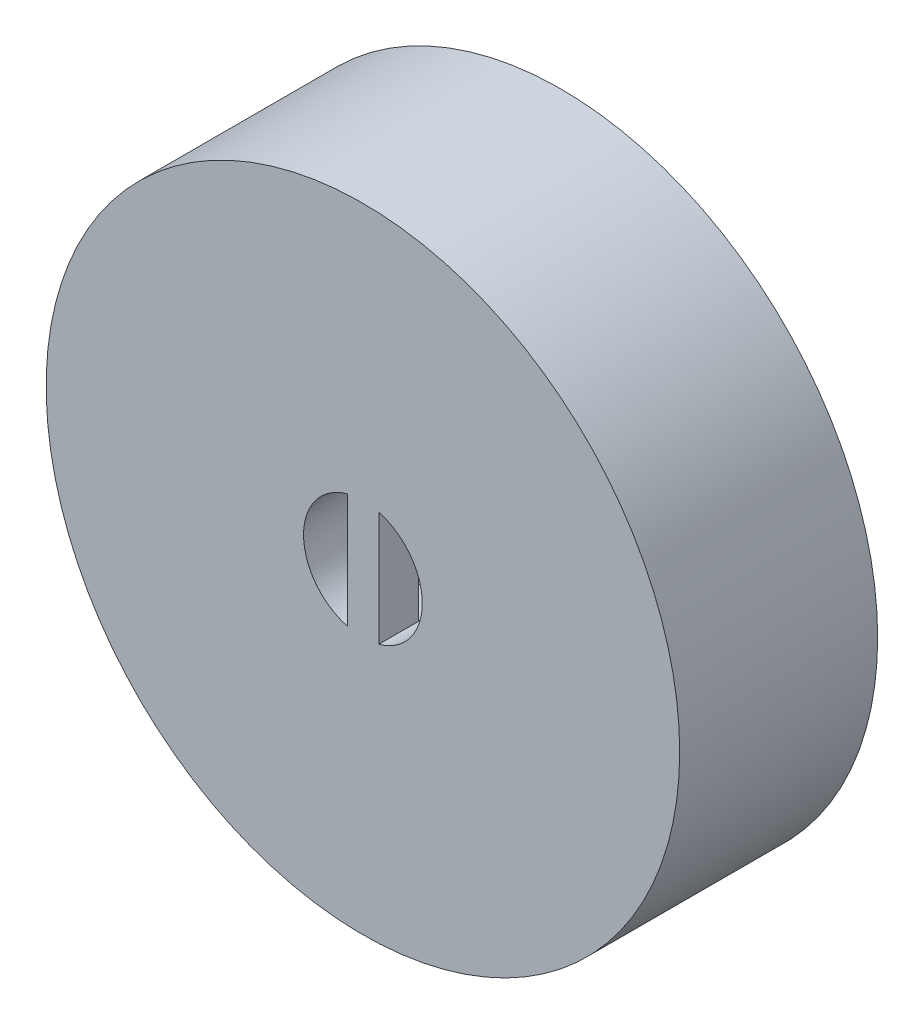
ISO-10303-21;
HEADER;
FILE_DESCRIPTION(('STEP AP214'),'2;1');
FILE_NAME('part.step','',(''),(''),'','','');
FILE_SCHEMA(('AUTOMOTIVE_DESIGN { 1 0 10303 214 1 1 1 1 }'));
ENDSEC;
DATA;
#1=APPLICATION_CONTEXT('core data for automotive mechanical design processes');
#2=APPLICATION_PROTOCOL_DEFINITION('international standard','automotive_design',2000,#1);
#3=PRODUCT_CONTEXT('',#1,'mechanical');
#4=PRODUCT('Part','Part','',(#3));
#5=PRODUCT_RELATED_PRODUCT_CATEGORY('part','',(#4));
#6=PRODUCT_DEFINITION_FORMATION('','',#4);
#7=PRODUCT_DEFINITION_CONTEXT('part definition',#1,'design');
#8=PRODUCT_DEFINITION('design','',#6,#7);
#9=PRODUCT_DEFINITION_SHAPE('','',#8);
#10=(LENGTH_UNIT() NAMED_UNIT(*) SI_UNIT(.MILLI.,.METRE.));
#11=(NAMED_UNIT(*) PLANE_ANGLE_UNIT() SI_UNIT($,.RADIAN.));
#12=(NAMED_UNIT(*) SI_UNIT($,.STERADIAN.) SOLID_ANGLE_UNIT());
#13=UNCERTAINTY_MEASURE_WITH_UNIT(LENGTH_MEASURE(1.E-05),#10,'distance_accuracy_value','');
#14=(GEOMETRIC_REPRESENTATION_CONTEXT(3) GLOBAL_UNCERTAINTY_ASSIGNED_CONTEXT((#13)) GLOBAL_UNIT_ASSIGNED_CONTEXT((#10,
#11,#12)) REPRESENTATION_CONTEXT('',''));
#15=CARTESIAN_POINT('',(0.,0.,0.));
#16=DIRECTION('',(0.,0.,1.));
#17=DIRECTION('',(1.,0.,0.));
#18=AXIS2_PLACEMENT_3D('',#15,#16,#17);
#19=CARTESIAN_POINT('',(-6.57556589733585,0.,-9.525));
#20=DIRECTION('',(0.,0.,-1.));
#21=DIRECTION('',(-1.,0.,0.));
#22=AXIS2_PLACEMENT_3D('',#19,#20,#21);
#23=PLANE('',#22);
#24=CARTESIAN_POINT('',(-6.57556589733585,0.,-9.525));
#25=DIRECTION('',(0.,0.,-1.));
#26=DIRECTION('',(-1.,0.,0.));
#27=AXIS2_PLACEMENT_3D('',#24,#25,#26);
#28=CIRCLE('',#27,9.525);
#29=CARTESIAN_POINT('',(2.94943410266415,0.,-9.525));
#30=VERTEX_POINT('',#29);
#31=EDGE_CURVE('E130',#30,#30,#28,.T.);
#32=ORIENTED_EDGE('',*,*,#31,.T.);
#33=EDGE_LOOP('',(#32));
#34=FACE_BOUND('',#33,.T.);
#35=CARTESIAN_POINT('',(-6.57556589733585,0.,-9.525));
#36=DIRECTION('',(0.,0.,1.));
#37=DIRECTION('',(1.,0.,0.));
#38=AXIS2_PLACEMENT_3D('',#35,#36,#37);
#39=CIRCLE('',#38,4.7625);
#40=CARTESIAN_POINT('',(-5.30556589733585,-4.5900442535993,-9.525));
#41=VERTEX_POINT('',#40);
#42=CARTESIAN_POINT('',(-5.30556589733585,4.5900442535993,-9.525));
#43=VERTEX_POINT('',#42);
#44=EDGE_CURVE('E121',#41,#43,#39,.T.);
#45=ORIENTED_EDGE('',*,*,#44,.T.);
#46=DIRECTION('',(-0.999997305514352,0.00232141423185958,0.));
#47=VECTOR('',#46,1.);
#48=CARTESIAN_POINT('',(-5.30556589733585,4.5900442535993,-9.525));
#49=LINE('',#48,#47);
#50=CARTESIAN_POINT('',(-7.82424147867847,4.59589115869367,-9.525));
#51=VERTEX_POINT('',#50);
#52=EDGE_CURVE('E106',#43,#51,#49,.T.);
#53=ORIENTED_EDGE('',*,*,#52,.T.);
#54=CARTESIAN_POINT('',(-6.57556589733585,0.,-9.525));
#55=DIRECTION('',(0.,0.,1.));
#56=DIRECTION('',(1.,0.,0.));
#57=AXIS2_PLACEMENT_3D('',#54,#55,#56);
#58=CIRCLE('',#57,4.7625);
#59=CARTESIAN_POINT('',(-7.82424147867847,-4.59589115869367,-9.525));
#60=VERTEX_POINT('',#59);
#61=EDGE_CURVE('E129',#51,#60,#58,.T.);
#62=ORIENTED_EDGE('',*,*,#61,.T.);
#63=DIRECTION('',(-0.999997305514352,-0.00232141423185924,0.));
#64=VECTOR('',#63,1.);
#65=CARTESIAN_POINT('',(-5.30556589733585,-4.5900442535993,-9.525));
#66=LINE('',#65,#64);
#67=EDGE_CURVE('E157',#41,#60,#66,.T.);
#68=ORIENTED_EDGE('',*,*,#67,.F.);
#69=EDGE_LOOP('',(#45,#53,#62,#68));
#70=FACE_BOUND('',#69,.T.);
#71=ADVANCED_FACE('F34',(#34,#70),#23,.T.);
#72=CARTESIAN_POINT('',(-5.30556589733585,4.5900442535993,-9.525));
#73=DIRECTION('',(-1.,0.,0.));
#74=DIRECTION('',(0.,0.,1.));
#75=AXIS2_PLACEMENT_3D('',#72,#73,#74);
#76=PLANE('',#75);
#77=DIRECTION('',(0.,-1.,0.));
#78=VECTOR('',#77,1.);
#79=CARTESIAN_POINT('',(-5.30556589733585,4.5900442535993,12.7));
#80=LINE('',#79,#78);
#81=CARTESIAN_POINT('',(-5.30556589733585,4.5900442535993,12.7));
#82=VERTEX_POINT('',#81);
#83=CARTESIAN_POINT('',(-5.30556589733585,-4.5900442535993,12.7));
#84=VERTEX_POINT('',#83);
#85=EDGE_CURVE('E97',#82,#84,#80,.T.);
#86=ORIENTED_EDGE('',*,*,#85,.F.);
#87=DIRECTION('',(0.,0.,1.));
#88=VECTOR('',#87,1.);
#89=CARTESIAN_POINT('',(-5.30556589733585,4.5900442535993,-9.525));
#90=LINE('',#89,#88);
#91=CARTESIAN_POINT('',(-5.30556589733585,4.5900442535993,15.875));
#92=VERTEX_POINT('',#91);
#93=EDGE_CURVE('E122',#82,#92,#90,.T.);
#94=ORIENTED_EDGE('',*,*,#93,.T.);
#95=DIRECTION('',(0.,1.,0.));
#96=VECTOR('',#95,1.);
#97=CARTESIAN_POINT('',(-5.30556589733585,4.5900442535993,15.875));
#98=LINE('',#97,#96);
#99=CARTESIAN_POINT('',(-5.30556589733585,-4.5900442535993,15.875));
#100=VERTEX_POINT('',#99);
#101=EDGE_CURVE('E112',#92,#100,#98,.F.);
#102=ORIENTED_EDGE('',*,*,#101,.T.);
#103=DIRECTION('',(0.,0.,1.));
#104=VECTOR('',#103,1.);
#105=CARTESIAN_POINT('',(-5.30556589733585,-4.5900442535993,-9.525));
#106=LINE('',#105,#104);
#107=EDGE_CURVE('E109',#84,#100,#106,.T.);
#108=ORIENTED_EDGE('',*,*,#107,.F.);
#109=EDGE_LOOP('',(#86,#94,#102,#108));
#110=FACE_BOUND('',#109,.T.);
#111=ADVANCED_FACE('F110',(#110),#76,.F.);
#112=CARTESIAN_POINT('',(-7.82424147867847,4.59589115869367,-9.525));
#113=DIRECTION('',(-1.,0.,0.));
#114=DIRECTION('',(0.,0.,1.));
#115=AXIS2_PLACEMENT_3D('',#112,#113,#114);
#116=PLANE('',#115);
#117=DIRECTION('',(0.,0.,1.));
#118=VECTOR('',#117,1.);
#119=CARTESIAN_POINT('',(-7.82424147867847,4.59589115869367,-9.525));
#120=LINE('',#119,#118);
#121=CARTESIAN_POINT('',(-7.82424147867847,4.59589115869367,12.7));
#122=VERTEX_POINT('',#121);
#123=CARTESIAN_POINT('',(-7.82424147867847,4.59589115869367,15.875));
#124=VERTEX_POINT('',#123);
#125=EDGE_CURVE('E52',#122,#124,#120,.T.);
#126=ORIENTED_EDGE('',*,*,#125,.F.);
#127=DIRECTION('',(0.,-1.,0.));
#128=VECTOR('',#127,1.);
#129=CARTESIAN_POINT('',(-7.82424147867847,4.59589115869367,12.7));
#130=LINE('',#129,#128);
#131=CARTESIAN_POINT('',(-7.82424147867847,-4.59589115869367,12.7));
#132=VERTEX_POINT('',#131);
#133=EDGE_CURVE('E96',#122,#132,#130,.T.);
#134=ORIENTED_EDGE('',*,*,#133,.T.);
#135=DIRECTION('',(0.,0.,1.));
#136=VECTOR('',#135,1.);
#137=CARTESIAN_POINT('',(-7.82424147867847,-4.59589115869367,-9.525));
#138=LINE('',#137,#136);
#139=CARTESIAN_POINT('',(-7.82424147867847,-4.59589115869367,15.875));
#140=VERTEX_POINT('',#139);
#141=EDGE_CURVE('E149',#132,#140,#138,.T.);
#142=ORIENTED_EDGE('',*,*,#141,.T.);
#143=DIRECTION('',(0.,1.,0.));
#144=VECTOR('',#143,1.);
#145=CARTESIAN_POINT('',(-7.82424147867847,0.,15.875));
#146=LINE('',#145,#144);
#147=EDGE_CURVE('E38',#124,#140,#146,.F.);
#148=ORIENTED_EDGE('',*,*,#147,.F.);
#149=EDGE_LOOP('',(#126,#134,#142,#148));
#150=FACE_BOUND('',#149,.T.);
#151=ADVANCED_FACE('F148',(#150),#116,.T.);
#152=CARTESIAN_POINT('',(-6.57556589733585,0.,15.875));
#153=DIRECTION('',(0.,0.,1.));
#154=DIRECTION('',(1.,0.,0.));
#155=AXIS2_PLACEMENT_3D('',#152,#153,#154);
#156=PLANE('',#155);
#157=CARTESIAN_POINT('',(-6.57556589733585,0.,15.875));
#158=DIRECTION('',(0.,0.,1.));
#159=DIRECTION('',(1.,0.,0.));
#160=AXIS2_PLACEMENT_3D('',#157,#158,#159);
#161=CIRCLE('',#160,4.7625);
#162=EDGE_CURVE('E139',#100,#92,#161,.T.);
#163=ORIENTED_EDGE('',*,*,#162,.F.);
#164=ORIENTED_EDGE('',*,*,#101,.F.);
#165=EDGE_LOOP('',(#163,#164));
#166=FACE_BOUND('',#165,.T.);
#167=CARTESIAN_POINT('',(-6.57556589733585,0.,15.875));
#168=DIRECTION('',(0.,0.,1.));
#169=DIRECTION('',(1.,0.,0.));
#170=AXIS2_PLACEMENT_3D('',#167,#168,#169);
#171=CIRCLE('',#170,25.4);
#172=CARTESIAN_POINT('',(18.8244341026641,0.,15.875));
#173=VERTEX_POINT('',#172);
#174=EDGE_CURVE('E44',#173,#173,#171,.T.);
#175=ORIENTED_EDGE('',*,*,#174,.T.);
#176=EDGE_LOOP('',(#175));
#177=FACE_BOUND('',#176,.T.);
#178=CARTESIAN_POINT('',(-6.57556589733585,0.,15.875));
#179=DIRECTION('',(0.,0.,1.));
#180=DIRECTION('',(1.,0.,0.));
#181=AXIS2_PLACEMENT_3D('',#178,#179,#180);
#182=CIRCLE('',#181,4.7625);
#183=EDGE_CURVE('E140',#124,#140,#182,.T.);
#184=ORIENTED_EDGE('',*,*,#183,.F.);
#185=ORIENTED_EDGE('',*,*,#147,.T.);
#186=EDGE_LOOP('',(#184,#185));
#187=FACE_BOUND('',#186,.T.);
#188=ADVANCED_FACE('F145',(#166,#177,#187),#156,.T.);
#189=CARTESIAN_POINT('',(-6.57556589733585,0.,15.875));
#190=DIRECTION('',(0.,0.,-1.));
#191=DIRECTION('',(-1.,0.,0.));
#192=AXIS2_PLACEMENT_3D('',#189,#190,#191);
#193=CYLINDRICAL_SURFACE('',#192,25.4);
#194=ORIENTED_EDGE('',*,*,#174,.F.);
#195=EDGE_LOOP('',(#194));
#196=FACE_BOUND('',#195,.T.);
#197=CARTESIAN_POINT('',(-6.57556589733585,0.,0.));
#198=DIRECTION('',(0.,0.,1.));
#199=DIRECTION('',(1.,0.,0.));
#200=AXIS2_PLACEMENT_3D('',#197,#198,#199);
#201=CIRCLE('',#200,25.4);
#202=CARTESIAN_POINT('',(18.8244341026641,0.,0.));
#203=VERTEX_POINT('',#202);
#204=EDGE_CURVE('E132',#203,#203,#201,.T.);
#205=ORIENTED_EDGE('',*,*,#204,.T.);
#206=EDGE_LOOP('',(#205));
#207=FACE_BOUND('',#206,.T.);
#208=ADVANCED_FACE('F36',(#196,#207),#193,.T.);
#209=CARTESIAN_POINT('',(-6.57556589733585,0.,0.));
#210=DIRECTION('',(0.,0.,1.));
#211=DIRECTION('',(1.,0.,0.));
#212=AXIS2_PLACEMENT_3D('',#209,#210,#211);
#213=PLANE('',#212);
#214=CARTESIAN_POINT('',(-6.57556589733585,0.,0.));
#215=DIRECTION('',(0.,0.,-1.));
#216=DIRECTION('',(-1.,0.,0.));
#217=AXIS2_PLACEMENT_3D('',#214,#215,#216);
#218=CIRCLE('',#217,9.525);
#219=CARTESIAN_POINT('',(2.94943410266415,0.,0.));
#220=VERTEX_POINT('',#219);
#221=EDGE_CURVE('E11',#220,#220,#218,.T.);
#222=ORIENTED_EDGE('',*,*,#221,.F.);
#223=EDGE_LOOP('',(#222));
#224=FACE_BOUND('',#223,.T.);
#225=ORIENTED_EDGE('',*,*,#204,.F.);
#226=EDGE_LOOP('',(#225));
#227=FACE_BOUND('',#226,.T.);
#228=ADVANCED_FACE('F185',(#224,#227),#213,.F.);
#229=CARTESIAN_POINT('',(-6.57556589733585,0.,-9.525));
#230=DIRECTION('',(0.,0.,1.));
#231=DIRECTION('',(1.,0.,0.));
#232=AXIS2_PLACEMENT_3D('',#229,#230,#231);
#233=CYLINDRICAL_SURFACE('',#232,9.525);
#234=CARTESIAN_POINT('',(2.94943410266415,0.,-9.525));
#235=CARTESIAN_POINT('',(2.94943410266415,0.,-9.42578125));
#236=CARTESIAN_POINT('',(2.94943410266415,0.,-9.3265625));
#237=CARTESIAN_POINT('',(2.94943410266415,0.,-9.128125));
#238=CARTESIAN_POINT('',(2.94943410266415,0.,-9.02890625));
#239=CARTESIAN_POINT('',(2.94943410266415,0.,-8.83046875));
#240=CARTESIAN_POINT('',(2.94943410266415,0.,-8.73125));
#241=CARTESIAN_POINT('',(2.94943410266415,0.,-8.5328125));
#242=CARTESIAN_POINT('',(2.94943410266415,0.,-8.43359375));
#243=CARTESIAN_POINT('',(2.94943410266415,0.,-8.23515625));
#244=CARTESIAN_POINT('',(2.94943410266415,0.,-8.1359375));
#245=CARTESIAN_POINT('',(2.94943410266415,0.,-7.9375));
#246=CARTESIAN_POINT('',(2.94943410266415,0.,-7.83828125));
#247=CARTESIAN_POINT('',(2.94943410266415,0.,-7.63984375));
#248=CARTESIAN_POINT('',(2.94943410266415,0.,-7.540625));
#249=CARTESIAN_POINT('',(2.94943410266415,0.,-7.3421875));
#250=CARTESIAN_POINT('',(2.94943410266415,0.,-7.24296875));
#251=CARTESIAN_POINT('',(2.94943410266415,0.,-7.04453125));
#252=CARTESIAN_POINT('',(2.94943410266415,0.,-6.9453125));
#253=CARTESIAN_POINT('',(2.94943410266415,0.,-6.746875));
#254=CARTESIAN_POINT('',(2.94943410266415,0.,-6.64765625));
#255=CARTESIAN_POINT('',(2.94943410266415,0.,-6.44921875));
#256=CARTESIAN_POINT('',(2.94943410266415,0.,-6.35));
#257=CARTESIAN_POINT('',(2.94943410266415,0.,-6.1515625));
#258=CARTESIAN_POINT('',(2.94943410266415,0.,-6.05234375));
#259=CARTESIAN_POINT('',(2.94943410266415,0.,-5.85390625));
#260=CARTESIAN_POINT('',(2.94943410266415,0.,-5.7546875));
#261=CARTESIAN_POINT('',(2.94943410266415,0.,-5.55625));
#262=CARTESIAN_POINT('',(2.94943410266415,0.,-5.45703125));
#263=CARTESIAN_POINT('',(2.94943410266415,0.,-5.25859375));
#264=CARTESIAN_POINT('',(2.94943410266415,0.,-5.159375));
#265=CARTESIAN_POINT('',(2.94943410266415,0.,-4.9609375));
#266=CARTESIAN_POINT('',(2.94943410266415,0.,-4.86171875));
#267=CARTESIAN_POINT('',(2.94943410266415,0.,-4.66328125));
#268=CARTESIAN_POINT('',(2.94943410266415,0.,-4.5640625));
#269=CARTESIAN_POINT('',(2.94943410266415,0.,-4.365625));
#270=CARTESIAN_POINT('',(2.94943410266415,0.,-4.26640625));
#271=CARTESIAN_POINT('',(2.94943410266415,0.,-4.06796875));
#272=CARTESIAN_POINT('',(2.94943410266415,0.,-3.96875));
#273=CARTESIAN_POINT('',(2.94943410266415,0.,-3.7703125));
#274=CARTESIAN_POINT('',(2.94943410266415,0.,-3.67109375));
#275=CARTESIAN_POINT('',(2.94943410266415,0.,-3.47265625));
#276=CARTESIAN_POINT('',(2.94943410266415,0.,-3.3734375));
#277=CARTESIAN_POINT('',(2.94943410266415,0.,-3.175));
#278=CARTESIAN_POINT('',(2.94943410266415,0.,-3.07578125));
#279=CARTESIAN_POINT('',(2.94943410266415,0.,-2.87734375));
#280=CARTESIAN_POINT('',(2.94943410266415,0.,-2.778125));
#281=CARTESIAN_POINT('',(2.94943410266415,0.,-2.5796875));
#282=CARTESIAN_POINT('',(2.94943410266415,0.,-2.48046875));
#283=CARTESIAN_POINT('',(2.94943410266415,0.,-2.28203125));
#284=CARTESIAN_POINT('',(2.94943410266415,0.,-2.1828125));
#285=CARTESIAN_POINT('',(2.94943410266415,0.,-1.984375));
#286=CARTESIAN_POINT('',(2.94943410266415,0.,-1.88515625));
#287=CARTESIAN_POINT('',(2.94943410266415,0.,-1.68671875));
#288=CARTESIAN_POINT('',(2.94943410266415,0.,-1.5875));
#289=CARTESIAN_POINT('',(2.94943410266415,0.,-1.3890625));
#290=CARTESIAN_POINT('',(2.94943410266415,0.,-1.28984375));
#291=CARTESIAN_POINT('',(2.94943410266415,0.,-1.09140625));
#292=CARTESIAN_POINT('',(2.94943410266415,0.,-0.992187500000001));
#293=CARTESIAN_POINT('',(2.94943410266415,0.,-0.793750000000001));
#294=CARTESIAN_POINT('',(2.94943410266415,0.,-0.69453125));
#295=CARTESIAN_POINT('',(2.94943410266415,0.,-0.49609375));
#296=CARTESIAN_POINT('',(2.94943410266415,0.,-0.396875));
#297=CARTESIAN_POINT('',(2.94943410266415,0.,-0.1984375));
#298=CARTESIAN_POINT('',(2.94943410266415,0.,-0.0992187500000001));
#299=CARTESIAN_POINT('',(2.94943410266415,0.,0.));
#300=B_SPLINE_CURVE_WITH_KNOTS('',3,(#234,#235,#236,#237,#238,#239,#240,#241,#242,#243,#244,
#245,#246,#247,#248,#249,#250,#251,#252,#253,#254,#255,#256,#257,#258,#259,#260,#261,#262,#263,
#264,#265,#266,#267,#268,#269,#270,#271,#272,#273,#274,#275,#276,#277,#278,#279,#280,#281,#282,
#283,#284,#285,#286,#287,#288,#289,#290,#291,#292,#293,#294,#295,#296,#297,#298,#299),
.UNSPECIFIED.,.F.,.F.,(4,2,2,2,2,2,2,2,2,2,2,2,2,2,2,2,2,2,2,2,2,2,2,2,2,2,2,2,2,2,2,2,4),(0.,
0.29765625,0.5953125,0.892968750000001,1.190625,1.48828125,1.7859375,2.08359375,2.38125,
2.67890625,2.9765625,3.27421875,3.571875,3.86953125,4.1671875,4.46484375,4.7625,5.06015625,
5.3578125,5.65546875,5.953125,6.25078125,6.5484375,6.84609375,7.14375,7.44140625,7.7390625,
8.03671875,8.334375,8.63203125,8.9296875,9.22734375,9.525),.UNSPECIFIED.);
#301=EDGE_CURVE('BSEAM171',#30,#220,#300,.T.);
#302=ORIENTED_EDGE('',*,*,#31,.F.);
#303=ORIENTED_EDGE('',*,*,#221,.T.);
#304=ORIENTED_EDGE('',*,*,#301,.T.);
#305=ORIENTED_EDGE('',*,*,#301,.F.);
#306=EDGE_LOOP('',(#302,#304,#303,#305));
#307=FACE_BOUND('',#306,.T.);
#308=ADVANCED_FACE('F171',(#307),#233,.T.);
#309=CARTESIAN_POINT('',(-6.57556589733585,0.,-9.525));
#310=DIRECTION('',(0.,0.,1.));
#311=DIRECTION('',(1.,0.,0.));
#312=AXIS2_PLACEMENT_3D('',#309,#310,#311);
#313=CYLINDRICAL_SURFACE('',#312,4.7625);
#314=ORIENTED_EDGE('',*,*,#162,.T.);
#315=ORIENTED_EDGE('',*,*,#93,.F.);
#316=EDGE_CURVE('E123',#43,#82,#90,.T.);
#317=ORIENTED_EDGE('',*,*,#316,.F.);
#318=ORIENTED_EDGE('',*,*,#44,.F.);
#319=EDGE_CURVE('E89',#41,#84,#106,.T.);
#320=ORIENTED_EDGE('',*,*,#319,.T.);
#321=ORIENTED_EDGE('',*,*,#107,.T.);
#322=EDGE_LOOP('',(#314,#315,#317,#318,#320,#321));
#323=FACE_BOUND('',#322,.T.);
#324=ADVANCED_FACE('F118',(#323),#313,.F.);
#325=CARTESIAN_POINT('',(-6.57556589733585,0.,-9.525));
#326=DIRECTION('',(0.,0.,1.));
#327=DIRECTION('',(1.,0.,0.));
#328=AXIS2_PLACEMENT_3D('',#325,#326,#327);
#329=CYLINDRICAL_SURFACE('',#328,4.7625);
#330=ORIENTED_EDGE('',*,*,#183,.T.);
#331=ORIENTED_EDGE('',*,*,#141,.F.);
#332=EDGE_CURVE('E92',#60,#132,#138,.T.);
#333=ORIENTED_EDGE('',*,*,#332,.F.);
#334=ORIENTED_EDGE('',*,*,#61,.F.);
#335=EDGE_CURVE('E150',#51,#122,#120,.T.);
#336=ORIENTED_EDGE('',*,*,#335,.T.);
#337=ORIENTED_EDGE('',*,*,#125,.T.);
#338=EDGE_LOOP('',(#330,#331,#333,#334,#336,#337));
#339=FACE_BOUND('',#338,.T.);
#340=ADVANCED_FACE('F163',(#339),#329,.F.);
#341=CARTESIAN_POINT('',(-5.30556589733585,4.5900442535993,12.7));
#342=DIRECTION('',(-0.00232141423185958,-0.999997305514352,0.));
#343=DIRECTION('',(0.999997305514352,-0.00232141423185958,0.));
#344=AXIS2_PLACEMENT_3D('',#341,#342,#343);
#345=PLANE('',#344);
#346=ORIENTED_EDGE('',*,*,#52,.F.);
#347=ORIENTED_EDGE('',*,*,#316,.T.);
#348=DIRECTION('',(-0.999997305514352,0.00232141423185958,0.));
#349=VECTOR('',#348,1.);
#350=CARTESIAN_POINT('',(-5.30556589733585,4.5900442535993,12.7));
#351=LINE('',#350,#349);
#352=EDGE_CURVE('E103',#82,#122,#351,.T.);
#353=ORIENTED_EDGE('',*,*,#352,.T.);
#354=ORIENTED_EDGE('',*,*,#335,.F.);
#355=EDGE_LOOP('',(#346,#347,#353,#354));
#356=FACE_BOUND('',#355,.T.);
#357=ADVANCED_FACE('F161',(#356),#345,.T.);
#358=CARTESIAN_POINT('',(-5.30556589733585,-4.5900442535993,12.7));
#359=DIRECTION('',(0.00232141423185924,-0.999997305514352,0.));
#360=DIRECTION('',(0.999997305514352,0.00232141423185924,0.));
#361=AXIS2_PLACEMENT_3D('',#358,#359,#360);
#362=PLANE('',#361);
#363=ORIENTED_EDGE('',*,*,#67,.T.);
#364=ORIENTED_EDGE('',*,*,#332,.T.);
#365=DIRECTION('',(-0.999997305514352,-0.00232141423185924,0.));
#366=VECTOR('',#365,1.);
#367=CARTESIAN_POINT('',(-5.30556589733585,-4.5900442535993,12.7));
#368=LINE('',#367,#366);
#369=EDGE_CURVE('E85',#84,#132,#368,.T.);
#370=ORIENTED_EDGE('',*,*,#369,.F.);
#371=ORIENTED_EDGE('',*,*,#319,.F.);
#372=EDGE_LOOP('',(#363,#364,#370,#371));
#373=FACE_BOUND('',#372,.T.);
#374=ADVANCED_FACE('F87',(#373),#362,.F.);
#375=CARTESIAN_POINT('',(0.,0.,12.7));
#376=DIRECTION('',(0.,0.,-1.));
#377=DIRECTION('',(-1.,0.,0.));
#378=AXIS2_PLACEMENT_3D('',#375,#376,#377);
#379=PLANE('',#378);
#380=ORIENTED_EDGE('',*,*,#85,.T.);
#381=ORIENTED_EDGE('',*,*,#369,.T.);
#382=ORIENTED_EDGE('',*,*,#133,.F.);
#383=ORIENTED_EDGE('',*,*,#352,.F.);
#384=EDGE_LOOP('',(#380,#381,#382,#383));
#385=FACE_BOUND('',#384,.T.);
#386=ADVANCED_FACE('F102',(#385),#379,.T.);
#387=CLOSED_SHELL('',(#71,#111,#151,#188,#208,#228,#308,#324,#340,#357,#374,#386));
#388=MANIFOLD_SOLID_BREP('B2',#387);
#389=ADVANCED_BREP_SHAPE_REPRESENTATION('',(#18,#388),#14);
#390=SHAPE_DEFINITION_REPRESENTATION(#9,#389);
ENDSEC;
END-ISO-10303-21;
